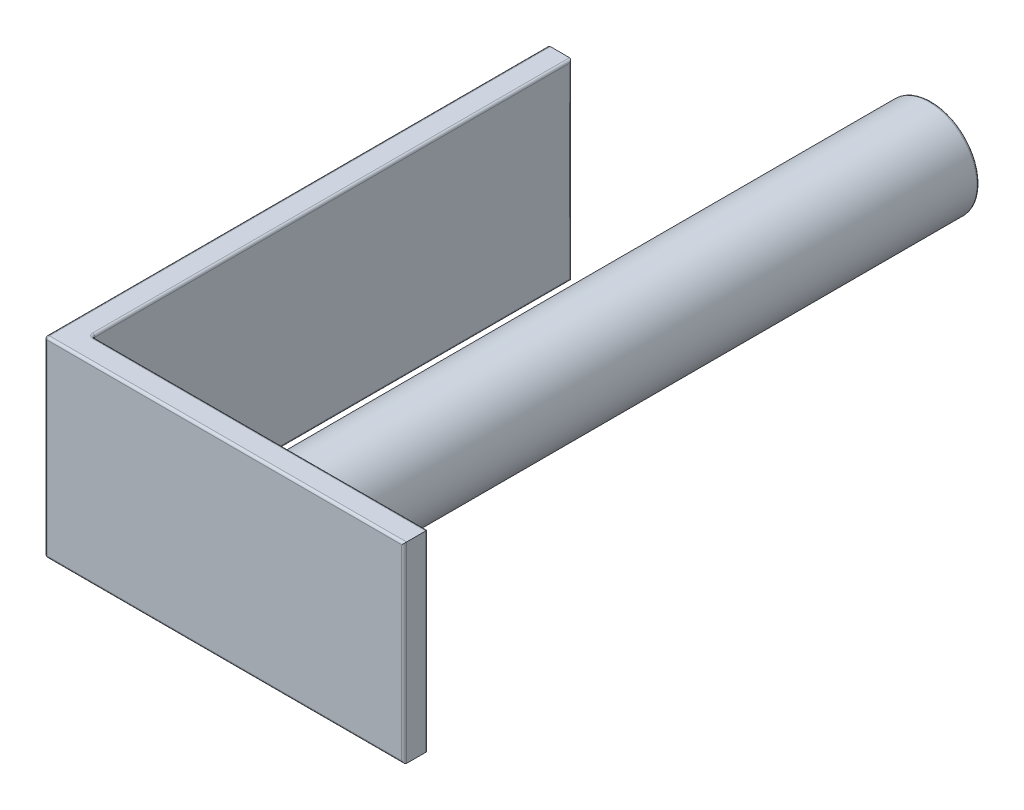
ISO-10303-21;
HEADER;
FILE_DESCRIPTION(('STEP AP214'),'2;1');
FILE_NAME('part.step','',(''),(''),'','','');
FILE_SCHEMA(('AUTOMOTIVE_DESIGN { 1 0 10303 214 1 1 1 1 }'));
ENDSEC;
DATA;
#1=APPLICATION_CONTEXT('core data for automotive mechanical design processes');
#2=APPLICATION_PROTOCOL_DEFINITION('international standard','automotive_design',2000,#1);
#3=PRODUCT_CONTEXT('',#1,'mechanical');
#4=PRODUCT('Part','Part','',(#3));
#5=PRODUCT_RELATED_PRODUCT_CATEGORY('part','',(#4));
#6=PRODUCT_DEFINITION_FORMATION('','',#4);
#7=PRODUCT_DEFINITION_CONTEXT('part definition',#1,'design');
#8=PRODUCT_DEFINITION('design','',#6,#7);
#9=PRODUCT_DEFINITION_SHAPE('','',#8);
#10=(LENGTH_UNIT() NAMED_UNIT(*) SI_UNIT(.MILLI.,.METRE.));
#11=(NAMED_UNIT(*) PLANE_ANGLE_UNIT() SI_UNIT($,.RADIAN.));
#12=(NAMED_UNIT(*) SI_UNIT($,.STERADIAN.) SOLID_ANGLE_UNIT());
#13=UNCERTAINTY_MEASURE_WITH_UNIT(LENGTH_MEASURE(1.E-05),#10,'distance_accuracy_value','');
#14=(GEOMETRIC_REPRESENTATION_CONTEXT(3) GLOBAL_UNCERTAINTY_ASSIGNED_CONTEXT((#13)) GLOBAL_UNIT_ASSIGNED_CONTEXT((#10,
#11,#12)) REPRESENTATION_CONTEXT('',''));
#15=CARTESIAN_POINT('',(0.,0.,0.));
#16=DIRECTION('',(0.,0.,1.));
#17=DIRECTION('',(1.,0.,0.));
#18=AXIS2_PLACEMENT_3D('',#15,#16,#17);
#19=CARTESIAN_POINT('',(0.,0.,-711.2));
#20=DIRECTION('',(0.,0.,1.));
#21=DIRECTION('',(1.,0.,0.));
#22=AXIS2_PLACEMENT_3D('',#19,#20,#21);
#23=CYLINDRICAL_SURFACE('',#22,50.8);
#24=CARTESIAN_POINT('',(0.,0.,-2.5400000000001));
#25=DIRECTION('',(0.,0.,1.));
#26=DIRECTION('',(1.,0.,0.));
#27=AXIS2_PLACEMENT_3D('',#24,#25,#26);
#28=CIRCLE('',#27,50.8);
#29=CARTESIAN_POINT('',(50.8,0.,-2.54000000000011));
#30=VERTEX_POINT('',#29);
#31=EDGE_CURVE('E244',#30,#30,#28,.F.);
#32=ORIENTED_EDGE('',*,*,#31,.T.);
#33=EDGE_LOOP('',(#32));
#34=FACE_BOUND('',#33,.T.);
#35=CARTESIAN_POINT('',(0.,0.,-708.66));
#36=DIRECTION('',(0.,0.,1.));
#37=DIRECTION('',(1.,0.,0.));
#38=AXIS2_PLACEMENT_3D('',#35,#36,#37);
#39=CIRCLE('',#38,50.8);
#40=CARTESIAN_POINT('',(50.8,0.,-708.66));
#41=VERTEX_POINT('',#40);
#42=EDGE_CURVE('E241',#41,#41,#39,.T.);
#43=ORIENTED_EDGE('',*,*,#42,.T.);
#44=EDGE_LOOP('',(#43));
#45=FACE_BOUND('',#44,.T.);
#46=ADVANCED_FACE('F39',(#34,#45),#23,.T.);
#47=CARTESIAN_POINT('',(0.,0.,-711.2));
#48=DIRECTION('',(0.,0.,1.));
#49=DIRECTION('',(1.,0.,0.));
#50=AXIS2_PLACEMENT_3D('',#47,#48,#49);
#51=PLANE('',#50);
#52=CARTESIAN_POINT('',(0.,0.,-711.2));
#53=DIRECTION('',(0.,0.,1.));
#54=DIRECTION('',(1.,0.,0.));
#55=AXIS2_PLACEMENT_3D('',#52,#53,#54);
#56=CIRCLE('',#55,48.26);
#57=CARTESIAN_POINT('',(48.26,0.,-711.2));
#58=VERTEX_POINT('',#57);
#59=EDGE_CURVE('E247',#58,#58,#56,.F.);
#60=ORIENTED_EDGE('',*,*,#59,.T.);
#61=EDGE_LOOP('',(#60));
#62=FACE_BOUND('',#61,.T.);
#63=ADVANCED_FACE('F347',(#62),#51,.F.);
#64=CARTESIAN_POINT('',(-177.8,101.6,0.));
#65=DIRECTION('',(-1.,0.,0.));
#66=DIRECTION('',(0.,0.,1.));
#67=AXIS2_PLACEMENT_3D('',#64,#65,#66);
#68=PLANE('',#67);
#69=DIRECTION('',(0.,-1.,0.));
#70=VECTOR('',#69,1.);
#71=CARTESIAN_POINT('',(-177.8,-101.6,-2.53999999999996));
#72=LINE('',#71,#70);
#73=CARTESIAN_POINT('',(-177.8,99.06,-2.53999999999996));
#74=VERTEX_POINT('',#73);
#75=CARTESIAN_POINT('',(-177.8,-99.06,-2.53999999999996));
#76=VERTEX_POINT('',#75);
#77=EDGE_CURVE('E166',#74,#76,#72,.T.);
#78=ORIENTED_EDGE('',*,*,#77,.T.);
#79=DIRECTION('',(0.,0.,-1.));
#80=VECTOR('',#79,1.);
#81=CARTESIAN_POINT('',(-177.8,-99.06,-508.));
#82=LINE('',#81,#80);
#83=CARTESIAN_POINT('',(-177.8,-99.06,-505.46));
#84=VERTEX_POINT('',#83);
#85=EDGE_CURVE('E64',#76,#84,#82,.T.);
#86=ORIENTED_EDGE('',*,*,#85,.T.);
#87=DIRECTION('',(0.,-1.,0.));
#88=VECTOR('',#87,1.);
#89=CARTESIAN_POINT('',(-177.8,101.6,-505.46));
#90=LINE('',#89,#88);
#91=CARTESIAN_POINT('',(-177.8,99.06,-505.46));
#92=VERTEX_POINT('',#91);
#93=EDGE_CURVE('E252',#84,#92,#90,.F.);
#94=ORIENTED_EDGE('',*,*,#93,.T.);
#95=DIRECTION('',(0.,0.,-1.));
#96=VECTOR('',#95,1.);
#97=CARTESIAN_POINT('',(-177.8,99.06,0.));
#98=LINE('',#97,#96);
#99=EDGE_CURVE('E250',#92,#74,#98,.F.);
#100=ORIENTED_EDGE('',*,*,#99,.T.);
#101=EDGE_LOOP('',(#78,#86,#94,#100));
#102=FACE_BOUND('',#101,.T.);
#103=ADVANCED_FACE('F353',(#102),#68,.F.);
#104=CARTESIAN_POINT('',(-203.2,101.6,-508.));
#105=DIRECTION('',(0.,0.,-1.));
#106=DIRECTION('',(-1.,0.,0.));
#107=AXIS2_PLACEMENT_3D('',#104,#105,#106);
#108=PLANE('',#107);
#109=DIRECTION('',(1.,0.,0.));
#110=VECTOR('',#109,1.);
#111=CARTESIAN_POINT('',(-203.2,-101.6,-508.));
#112=LINE('',#111,#110);
#113=CARTESIAN_POINT('',(-200.66,-101.6,-508.));
#114=VERTEX_POINT('',#113);
#115=CARTESIAN_POINT('',(-180.34,-101.6,-508.));
#116=VERTEX_POINT('',#115);
#117=EDGE_CURVE('E271',#114,#116,#112,.T.);
#118=ORIENTED_EDGE('',*,*,#117,.F.);
#119=DIRECTION('',(0.,-1.,0.));
#120=VECTOR('',#119,1.);
#121=CARTESIAN_POINT('',(-200.66,101.6,-508.));
#122=LINE('',#121,#120);
#123=CARTESIAN_POINT('',(-200.66,101.6,-508.));
#124=VERTEX_POINT('',#123);
#125=EDGE_CURVE('E11',#114,#124,#122,.F.);
#126=ORIENTED_EDGE('',*,*,#125,.T.);
#127=DIRECTION('',(1.,0.,0.));
#128=VECTOR('',#127,1.);
#129=CARTESIAN_POINT('',(-203.2,101.6,-508.));
#130=LINE('',#129,#128);
#131=CARTESIAN_POINT('',(-180.34,101.6,-508.));
#132=VERTEX_POINT('',#131);
#133=EDGE_CURVE('E188',#124,#132,#130,.T.);
#134=ORIENTED_EDGE('',*,*,#133,.T.);
#135=DIRECTION('',(0.,-1.,0.));
#136=VECTOR('',#135,1.);
#137=CARTESIAN_POINT('',(-180.34,-101.6,-508.));
#138=LINE('',#137,#136);
#139=EDGE_CURVE('E48',#132,#116,#138,.T.);
#140=ORIENTED_EDGE('',*,*,#139,.T.);
#141=EDGE_LOOP('',(#118,#126,#134,#140));
#142=FACE_BOUND('',#141,.T.);
#143=ADVANCED_FACE('F597',(#142),#108,.T.);
#144=CARTESIAN_POINT('',(-203.2,101.6,0.));
#145=DIRECTION('',(-1.,0.,0.));
#146=DIRECTION('',(0.,0.,1.));
#147=AXIS2_PLACEMENT_3D('',#144,#145,#146);
#148=PLANE('',#147);
#149=DIRECTION('',(0.,-1.,0.));
#150=VECTOR('',#149,1.);
#151=CARTESIAN_POINT('',(-203.2,101.6,22.86));
#152=LINE('',#151,#150);
#153=CARTESIAN_POINT('',(-203.2,-99.06,22.86));
#154=VERTEX_POINT('',#153);
#155=CARTESIAN_POINT('',(-203.2,99.06,22.86));
#156=VERTEX_POINT('',#155);
#157=EDGE_CURVE('E222',#154,#156,#152,.F.);
#158=ORIENTED_EDGE('',*,*,#157,.T.);
#159=DIRECTION('',(0.,0.,-1.));
#160=VECTOR('',#159,1.);
#161=CARTESIAN_POINT('',(-203.2,99.06,-508.));
#162=LINE('',#161,#160);
#163=CARTESIAN_POINT('',(-203.2,99.06,-505.46));
#164=VERTEX_POINT('',#163);
#165=EDGE_CURVE('E225',#156,#164,#162,.T.);
#166=ORIENTED_EDGE('',*,*,#165,.T.);
#167=DIRECTION('',(0.,-1.,0.));
#168=VECTOR('',#167,1.);
#169=CARTESIAN_POINT('',(-203.2,101.6,-505.46));
#170=LINE('',#169,#168);
#171=CARTESIAN_POINT('',(-203.2,-99.06,-505.46));
#172=VERTEX_POINT('',#171);
#173=EDGE_CURVE('E220',#164,#172,#170,.T.);
#174=ORIENTED_EDGE('',*,*,#173,.T.);
#175=DIRECTION('',(0.,0.,-1.));
#176=VECTOR('',#175,1.);
#177=CARTESIAN_POINT('',(-203.2,-99.06,0.));
#178=LINE('',#177,#176);
#179=EDGE_CURVE('E218',#172,#154,#178,.F.);
#180=ORIENTED_EDGE('',*,*,#179,.T.);
#181=EDGE_LOOP('',(#158,#166,#174,#180));
#182=FACE_BOUND('',#181,.T.);
#183=ADVANCED_FACE('F313',(#182),#148,.T.);
#184=CARTESIAN_POINT('',(177.8,101.6,25.3999999999999));
#185=DIRECTION('',(0.,0.,1.));
#186=DIRECTION('',(1.,0.,0.));
#187=AXIS2_PLACEMENT_3D('',#184,#185,#186);
#188=PLANE('',#187);
#189=DIRECTION('',(-1.,0.,0.));
#190=VECTOR('',#189,1.);
#191=CARTESIAN_POINT('',(-203.2,99.06,25.4000000000001));
#192=LINE('',#191,#190);
#193=CARTESIAN_POINT('',(175.26,99.06,25.3999999999999));
#194=VERTEX_POINT('',#193);
#195=CARTESIAN_POINT('',(-200.66,99.06,25.4));
#196=VERTEX_POINT('',#195);
#197=EDGE_CURVE('E213',#194,#196,#192,.T.);
#198=ORIENTED_EDGE('',*,*,#197,.T.);
#199=DIRECTION('',(0.,-1.,0.));
#200=VECTOR('',#199,1.);
#201=CARTESIAN_POINT('',(-200.66,101.6,25.4));
#202=LINE('',#201,#200);
#203=CARTESIAN_POINT('',(-200.66,-99.06,25.4));
#204=VERTEX_POINT('',#203);
#205=EDGE_CURVE('E215',#196,#204,#202,.T.);
#206=ORIENTED_EDGE('',*,*,#205,.T.);
#207=DIRECTION('',(-1.,0.,0.));
#208=VECTOR('',#207,1.);
#209=CARTESIAN_POINT('',(177.8,-99.06,25.3999999999999));
#210=LINE('',#209,#208);
#211=CARTESIAN_POINT('',(175.26,-99.06,25.3999999999999));
#212=VERTEX_POINT('',#211);
#213=EDGE_CURVE('E209',#204,#212,#210,.F.);
#214=ORIENTED_EDGE('',*,*,#213,.T.);
#215=DIRECTION('',(0.,-1.,0.));
#216=VECTOR('',#215,1.);
#217=CARTESIAN_POINT('',(175.26,101.6,25.3999999999999));
#218=LINE('',#217,#216);
#219=EDGE_CURVE('E211',#212,#194,#218,.F.);
#220=ORIENTED_EDGE('',*,*,#219,.T.);
#221=EDGE_LOOP('',(#198,#206,#214,#220));
#222=FACE_BOUND('',#221,.T.);
#223=ADVANCED_FACE('F331',(#222),#188,.T.);
#224=CARTESIAN_POINT('',(177.8,101.6,0.));
#225=DIRECTION('',(1.,0.,0.));
#226=DIRECTION('',(0.,0.,-1.));
#227=AXIS2_PLACEMENT_3D('',#224,#225,#226);
#228=PLANE('',#227);
#229=DIRECTION('',(0.,0.,1.));
#230=VECTOR('',#229,1.);
#231=CARTESIAN_POINT('',(177.8,101.6,0.));
#232=LINE('',#231,#230);
#233=CARTESIAN_POINT('',(177.8,101.6,2.53999999999993));
#234=VERTEX_POINT('',#233);
#235=CARTESIAN_POINT('',(177.8,101.6,22.8599999999999));
#236=VERTEX_POINT('',#235);
#237=EDGE_CURVE('E184',#234,#236,#232,.T.);
#238=ORIENTED_EDGE('',*,*,#237,.T.);
#239=DIRECTION('',(0.,-1.,0.));
#240=VECTOR('',#239,1.);
#241=CARTESIAN_POINT('',(177.8,101.6,22.8599999999999));
#242=LINE('',#241,#240);
#243=CARTESIAN_POINT('',(177.8,-101.6,22.8599999999999));
#244=VERTEX_POINT('',#243);
#245=EDGE_CURVE('E239',#236,#244,#242,.T.);
#246=ORIENTED_EDGE('',*,*,#245,.T.);
#247=DIRECTION('',(0.,0.,1.));
#248=VECTOR('',#247,1.);
#249=CARTESIAN_POINT('',(177.8,-101.6,0.));
#250=LINE('',#249,#248);
#251=CARTESIAN_POINT('',(177.8,-101.6,2.53999999999993));
#252=VERTEX_POINT('',#251);
#253=EDGE_CURVE('E191',#252,#244,#250,.T.);
#254=ORIENTED_EDGE('',*,*,#253,.F.);
#255=DIRECTION('',(0.,-1.,0.));
#256=VECTOR('',#255,1.);
#257=CARTESIAN_POINT('',(177.8,101.6,2.53999999999993));
#258=LINE('',#257,#256);
#259=EDGE_CURVE('E237',#252,#234,#258,.F.);
#260=ORIENTED_EDGE('',*,*,#259,.T.);
#261=EDGE_LOOP('',(#238,#246,#254,#260));
#262=FACE_BOUND('',#261,.T.);
#263=ADVANCED_FACE('F570',(#262),#228,.T.);
#264=CARTESIAN_POINT('',(177.8,101.6,0.));
#265=DIRECTION('',(0.,0.,1.));
#266=DIRECTION('',(1.,0.,0.));
#267=AXIS2_PLACEMENT_3D('',#264,#265,#266);
#268=PLANE('',#267);
#269=CARTESIAN_POINT('',(0.,0.,0.));
#270=DIRECTION('',(0.,0.,1.));
#271=DIRECTION('',(1.,0.,0.));
#272=AXIS2_PLACEMENT_3D('',#269,#270,#271);
#273=CIRCLE('',#272,53.34);
#274=CARTESIAN_POINT('',(53.34,0.,0.));
#275=VERTEX_POINT('',#274);
#276=EDGE_CURVE('E195',#275,#275,#273,.T.);
#277=ORIENTED_EDGE('',*,*,#276,.T.);
#278=EDGE_LOOP('',(#277));
#279=FACE_BOUND('',#278,.T.);
#280=DIRECTION('',(0.,-1.,0.));
#281=VECTOR('',#280,1.);
#282=CARTESIAN_POINT('',(175.26,-101.6,0.));
#283=LINE('',#282,#281);
#284=CARTESIAN_POINT('',(175.26,99.06,0.));
#285=VERTEX_POINT('',#284);
#286=CARTESIAN_POINT('',(175.26,-99.06,0.));
#287=VERTEX_POINT('',#286);
#288=EDGE_CURVE('E159',#285,#287,#283,.T.);
#289=ORIENTED_EDGE('',*,*,#288,.T.);
#290=DIRECTION('',(-1.,0.,0.));
#291=VECTOR('',#290,1.);
#292=CARTESIAN_POINT('',(-177.8,-99.06,0.));
#293=LINE('',#292,#291);
#294=CARTESIAN_POINT('',(-175.26,-99.06,0.));
#295=VERTEX_POINT('',#294);
#296=EDGE_CURVE('E157',#287,#295,#293,.T.);
#297=ORIENTED_EDGE('',*,*,#296,.T.);
#298=DIRECTION('',(0.,-1.,0.));
#299=VECTOR('',#298,1.);
#300=CARTESIAN_POINT('',(-175.26,101.6,0.));
#301=LINE('',#300,#299);
#302=CARTESIAN_POINT('',(-175.26,99.06,0.));
#303=VERTEX_POINT('',#302);
#304=EDGE_CURVE('E150',#295,#303,#301,.F.);
#305=ORIENTED_EDGE('',*,*,#304,.T.);
#306=DIRECTION('',(-1.,0.,0.));
#307=VECTOR('',#306,1.);
#308=CARTESIAN_POINT('',(177.8,99.06,0.));
#309=LINE('',#308,#307);
#310=EDGE_CURVE('E154',#303,#285,#309,.F.);
#311=ORIENTED_EDGE('',*,*,#310,.T.);
#312=EDGE_LOOP('',(#289,#297,#305,#311));
#313=FACE_BOUND('',#312,.T.);
#314=ADVANCED_FACE('F152',(#279,#313),#268,.F.);
#315=CARTESIAN_POINT('',(0.,101.6,0.));
#316=DIRECTION('',(0.,-1.,0.));
#317=DIRECTION('',(-1.,0.,0.));
#318=AXIS2_PLACEMENT_3D('',#315,#316,#317);
#319=PLANE('',#318);
#320=DIRECTION('',(0.,0.,-1.));
#321=VECTOR('',#320,1.);
#322=CARTESIAN_POINT('',(-200.66,101.6,25.4000000000001));
#323=LINE('',#322,#321);
#324=CARTESIAN_POINT('',(-200.66,101.6,22.86));
#325=VERTEX_POINT('',#324);
#326=EDGE_CURVE('E232',#124,#325,#323,.F.);
#327=ORIENTED_EDGE('',*,*,#326,.T.);
#328=DIRECTION('',(-1.,0.,0.));
#329=VECTOR('',#328,1.);
#330=CARTESIAN_POINT('',(177.8,101.6,22.8599999999999));
#331=LINE('',#330,#329);
#332=EDGE_CURVE('E234',#325,#236,#331,.F.);
#333=ORIENTED_EDGE('',*,*,#332,.T.);
#334=ORIENTED_EDGE('',*,*,#237,.F.);
#335=DIRECTION('',(-1.,0.,0.));
#336=VECTOR('',#335,1.);
#337=CARTESIAN_POINT('',(0.,101.6,2.53999999999999));
#338=LINE('',#337,#336);
#339=CARTESIAN_POINT('',(-175.26,101.6,2.54000000000004));
#340=VERTEX_POINT('',#339);
#341=EDGE_CURVE('E228',#234,#340,#338,.T.);
#342=ORIENTED_EDGE('',*,*,#341,.T.);
#343=CARTESIAN_POINT('',(-175.26,101.6,-2.53999999999996));
#344=DIRECTION('',(0.,-1.,0.));
#345=DIRECTION('',(0.,0.,-1.));
#346=AXIS2_PLACEMENT_3D('',#343,#344,#345);
#347=CIRCLE('',#346,5.08);
#348=CARTESIAN_POINT('',(-180.34,101.6,-2.53999999999996));
#349=VERTEX_POINT('',#348);
#350=EDGE_CURVE('E175',#349,#340,#347,.F.);
#351=ORIENTED_EDGE('',*,*,#350,.F.);
#352=DIRECTION('',(0.,0.,-1.));
#353=VECTOR('',#352,1.);
#354=CARTESIAN_POINT('',(-180.34,101.6,0.));
#355=LINE('',#354,#353);
#356=EDGE_CURVE('E230',#349,#132,#355,.T.);
#357=ORIENTED_EDGE('',*,*,#356,.T.);
#358=ORIENTED_EDGE('',*,*,#133,.F.);
#359=EDGE_LOOP('',(#327,#333,#334,#342,#351,#357,#358));
#360=FACE_BOUND('',#359,.T.);
#361=ADVANCED_FACE('F551',(#360),#319,.F.);
#362=CARTESIAN_POINT('',(0.,-101.6,0.));
#363=DIRECTION('',(0.,-1.,0.));
#364=DIRECTION('',(-1.,0.,0.));
#365=AXIS2_PLACEMENT_3D('',#362,#363,#364);
#366=PLANE('',#365);
#367=CARTESIAN_POINT('',(-175.26,-101.6,-2.53999999999996));
#368=DIRECTION('',(0.,-1.,0.));
#369=DIRECTION('',(0.,0.,-1.));
#370=AXIS2_PLACEMENT_3D('',#367,#368,#369);
#371=CIRCLE('',#370,5.08);
#372=CARTESIAN_POINT('',(-175.26,-101.6,2.54000000000004));
#373=VERTEX_POINT('',#372);
#374=CARTESIAN_POINT('',(-180.34,-101.6,-2.53999999999996));
#375=VERTEX_POINT('',#374);
#376=EDGE_CURVE('E202',#373,#375,#371,.T.);
#377=ORIENTED_EDGE('',*,*,#376,.F.);
#378=DIRECTION('',(-1.,0.,0.));
#379=VECTOR('',#378,1.);
#380=CARTESIAN_POINT('',(177.8,-101.6,2.53999999999993));
#381=LINE('',#380,#379);
#382=EDGE_CURVE('E206',#373,#252,#381,.F.);
#383=ORIENTED_EDGE('',*,*,#382,.T.);
#384=ORIENTED_EDGE('',*,*,#253,.T.);
#385=DIRECTION('',(-1.,0.,0.));
#386=VECTOR('',#385,1.);
#387=CARTESIAN_POINT('',(0.,-101.6,22.86));
#388=LINE('',#387,#386);
#389=CARTESIAN_POINT('',(-200.66,-101.6,22.86));
#390=VERTEX_POINT('',#389);
#391=EDGE_CURVE('E200',#244,#390,#388,.T.);
#392=ORIENTED_EDGE('',*,*,#391,.T.);
#393=DIRECTION('',(0.,0.,-1.));
#394=VECTOR('',#393,1.);
#395=CARTESIAN_POINT('',(-200.66,-101.6,0.));
#396=LINE('',#395,#394);
#397=EDGE_CURVE('E198',#390,#114,#396,.T.);
#398=ORIENTED_EDGE('',*,*,#397,.T.);
#399=ORIENTED_EDGE('',*,*,#117,.T.);
#400=DIRECTION('',(0.,0.,-1.));
#401=VECTOR('',#400,1.);
#402=CARTESIAN_POINT('',(-180.34,-101.6,0.));
#403=LINE('',#402,#401);
#404=EDGE_CURVE('E204',#116,#375,#403,.F.);
#405=ORIENTED_EDGE('',*,*,#404,.T.);
#406=EDGE_LOOP('',(#377,#383,#384,#392,#398,#399,#405));
#407=FACE_BOUND('',#406,.T.);
#408=ADVANCED_FACE('F388',(#407),#366,.T.);
#409=CARTESIAN_POINT('',(-180.34,99.06,0.));
#410=DIRECTION('',(0.,0.,-1.));
#411=DIRECTION('',(-1.,0.,0.));
#412=AXIS2_PLACEMENT_3D('',#409,#410,#411);
#413=CYLINDRICAL_SURFACE('',#412,2.54);
#414=CARTESIAN_POINT('',(-180.34,99.06,-505.46));
#415=DIRECTION('',(0.,-0.707106781186547,-0.707106781186547));
#416=DIRECTION('',(0.,0.707106781186547,-0.707106781186547));
#417=AXIS2_PLACEMENT_3D('',#414,#415,#416);
#418=ELLIPSE('',#417,3.59210244842766,2.54);
#419=EDGE_CURVE('E178',#132,#92,#418,.T.);
#420=ORIENTED_EDGE('',*,*,#419,.F.);
#421=ORIENTED_EDGE('',*,*,#356,.F.);
#422=CARTESIAN_POINT('',(-180.34,99.06,-2.53999999999996));
#423=DIRECTION('',(0.,0.,1.));
#424=DIRECTION('',(1.,0.,0.));
#425=AXIS2_PLACEMENT_3D('',#422,#423,#424);
#426=CIRCLE('',#425,2.54);
#427=EDGE_CURVE('E269',#74,#349,#426,.T.);
#428=ORIENTED_EDGE('',*,*,#427,.F.);
#429=ORIENTED_EDGE('',*,*,#99,.F.);
#430=EDGE_LOOP('',(#420,#421,#428,#429));
#431=FACE_BOUND('',#430,.T.);
#432=ADVANCED_FACE('F385',(#431),#413,.T.);
#433=CARTESIAN_POINT('',(-175.26,99.06,-2.53999999999996));
#434=DIRECTION('',(0.,-1.,0.));
#435=DIRECTION('',(0.,0.,-1.));
#436=AXIS2_PLACEMENT_3D('',#433,#434,#435);
#437=TOROIDAL_SURFACE('',#436,5.08,2.54);
#438=ORIENTED_EDGE('',*,*,#427,.T.);
#439=ORIENTED_EDGE('',*,*,#350,.T.);
#440=CARTESIAN_POINT('',(-175.26,99.06,2.54000000000004));
#441=DIRECTION('',(-1.,0.,0.));
#442=DIRECTION('',(0.,0.,1.));
#443=AXIS2_PLACEMENT_3D('',#440,#441,#442);
#444=CIRCLE('',#443,2.54);
#445=EDGE_CURVE('E169',#303,#340,#444,.F.);
#446=ORIENTED_EDGE('',*,*,#445,.F.);
#447=CARTESIAN_POINT('',(-175.26,99.06,-2.53999999999996));
#448=DIRECTION('',(0.,-1.,0.));
#449=DIRECTION('',(0.,0.,-1.));
#450=AXIS2_PLACEMENT_3D('',#447,#448,#449);
#451=CIRCLE('',#450,2.54);
#452=EDGE_CURVE('E163',#74,#303,#451,.F.);
#453=ORIENTED_EDGE('',*,*,#452,.F.);
#454=EDGE_LOOP('',(#438,#439,#446,#453));
#455=FACE_BOUND('',#454,.T.);
#456=ADVANCED_FACE('F174',(#455),#437,.T.);
#457=CARTESIAN_POINT('',(-180.34,101.6,-505.46));
#458=DIRECTION('',(0.,1.,0.));
#459=DIRECTION('',(0.,0.,1.));
#460=AXIS2_PLACEMENT_3D('',#457,#458,#459);
#461=CYLINDRICAL_SURFACE('',#460,2.54);
#462=ORIENTED_EDGE('',*,*,#419,.T.);
#463=ORIENTED_EDGE('',*,*,#93,.F.);
#464=CARTESIAN_POINT('',(-180.34,-99.06,-505.46));
#465=DIRECTION('',(0.,-0.707106781186547,0.707106781186547));
#466=DIRECTION('',(0.,0.707106781186547,0.707106781186547));
#467=AXIS2_PLACEMENT_3D('',#464,#465,#466);
#468=ELLIPSE('',#467,3.59210244842766,2.54);
#469=EDGE_CURVE('E170',#116,#84,#468,.T.);
#470=ORIENTED_EDGE('',*,*,#469,.F.);
#471=ORIENTED_EDGE('',*,*,#139,.F.);
#472=EDGE_LOOP('',(#462,#463,#470,#471));
#473=FACE_BOUND('',#472,.T.);
#474=ADVANCED_FACE('F379',(#473),#461,.T.);
#475=CARTESIAN_POINT('',(0.,99.06,2.53999999999999));
#476=DIRECTION('',(-1.,0.,0.));
#477=DIRECTION('',(0.,0.,1.));
#478=AXIS2_PLACEMENT_3D('',#475,#476,#477);
#479=CYLINDRICAL_SURFACE('',#478,2.54);
#480=ORIENTED_EDGE('',*,*,#445,.T.);
#481=ORIENTED_EDGE('',*,*,#341,.F.);
#482=CARTESIAN_POINT('',(175.26,99.06,2.53999999999993));
#483=DIRECTION('',(-0.707106781186547,0.707106781186547,0.));
#484=DIRECTION('',(-0.707106781186547,-0.707106781186547,0.));
#485=AXIS2_PLACEMENT_3D('',#482,#483,#484);
#486=ELLIPSE('',#485,3.59210244842766,2.54);
#487=EDGE_CURVE('E182',#285,#234,#486,.F.);
#488=ORIENTED_EDGE('',*,*,#487,.F.);
#489=ORIENTED_EDGE('',*,*,#310,.F.);
#490=EDGE_LOOP('',(#480,#481,#488,#489));
#491=FACE_BOUND('',#490,.T.);
#492=ADVANCED_FACE('F180',(#491),#479,.T.);
#493=CARTESIAN_POINT('',(-175.26,101.6,-2.53999999999996));
#494=DIRECTION('',(0.,1.,0.));
#495=DIRECTION('',(0.,0.,1.));
#496=AXIS2_PLACEMENT_3D('',#493,#494,#495);
#497=CYLINDRICAL_SURFACE('',#496,2.54);
#498=ORIENTED_EDGE('',*,*,#452,.T.);
#499=ORIENTED_EDGE('',*,*,#304,.F.);
#500=CARTESIAN_POINT('',(-175.26,-99.06,-2.53999999999996));
#501=DIRECTION('',(0.,-1.,0.));
#502=DIRECTION('',(0.,0.,-1.));
#503=AXIS2_PLACEMENT_3D('',#500,#501,#502);
#504=CIRCLE('',#503,2.54);
#505=EDGE_CURVE('E262',#76,#295,#504,.F.);
#506=ORIENTED_EDGE('',*,*,#505,.F.);
#507=ORIENTED_EDGE('',*,*,#77,.F.);
#508=EDGE_LOOP('',(#498,#499,#506,#507));
#509=FACE_BOUND('',#508,.T.);
#510=ADVANCED_FACE('F165',(#509),#497,.F.);
#511=CARTESIAN_POINT('',(-180.34,-99.06,0.));
#512=DIRECTION('',(0.,0.,1.));
#513=DIRECTION('',(1.,0.,0.));
#514=AXIS2_PLACEMENT_3D('',#511,#512,#513);
#515=CYLINDRICAL_SURFACE('',#514,2.54);
#516=ORIENTED_EDGE('',*,*,#469,.T.);
#517=ORIENTED_EDGE('',*,*,#85,.F.);
#518=CARTESIAN_POINT('',(-180.34,-99.06,-2.53999999999996));
#519=DIRECTION('',(0.,0.,1.));
#520=DIRECTION('',(1.,0.,0.));
#521=AXIS2_PLACEMENT_3D('',#518,#519,#520);
#522=CIRCLE('',#521,2.54);
#523=EDGE_CURVE('E56',#375,#76,#522,.T.);
#524=ORIENTED_EDGE('',*,*,#523,.F.);
#525=ORIENTED_EDGE('',*,*,#404,.F.);
#526=EDGE_LOOP('',(#516,#517,#524,#525));
#527=FACE_BOUND('',#526,.T.);
#528=ADVANCED_FACE('F370',(#527),#515,.T.);
#529=CARTESIAN_POINT('',(175.26,101.6,2.53999999999993));
#530=DIRECTION('',(0.,1.,0.));
#531=DIRECTION('',(0.,0.,1.));
#532=AXIS2_PLACEMENT_3D('',#529,#530,#531);
#533=CYLINDRICAL_SURFACE('',#532,2.54);
#534=ORIENTED_EDGE('',*,*,#487,.T.);
#535=ORIENTED_EDGE('',*,*,#259,.F.);
#536=CARTESIAN_POINT('',(175.26,-99.06,2.53999999999993));
#537=DIRECTION('',(0.707106781186547,0.707106781186547,0.));
#538=DIRECTION('',(-0.707106781186547,0.707106781186547,0.));
#539=AXIS2_PLACEMENT_3D('',#536,#537,#538);
#540=ELLIPSE('',#539,3.59210244842766,2.54);
#541=EDGE_CURVE('E259',#287,#252,#540,.F.);
#542=ORIENTED_EDGE('',*,*,#541,.F.);
#543=ORIENTED_EDGE('',*,*,#288,.F.);
#544=EDGE_LOOP('',(#534,#535,#542,#543));
#545=FACE_BOUND('',#544,.T.);
#546=ADVANCED_FACE('F367',(#545),#533,.T.);
#547=CARTESIAN_POINT('',(-175.26,-99.06,-2.53999999999996));
#548=DIRECTION('',(0.,-1.,0.));
#549=DIRECTION('',(0.,0.,-1.));
#550=AXIS2_PLACEMENT_3D('',#547,#548,#549);
#551=TOROIDAL_SURFACE('',#550,5.08,2.54);
#552=ORIENTED_EDGE('',*,*,#523,.T.);
#553=ORIENTED_EDGE('',*,*,#505,.T.);
#554=CARTESIAN_POINT('',(-175.26,-99.06,2.54000000000004));
#555=DIRECTION('',(-1.,0.,0.));
#556=DIRECTION('',(0.,0.,1.));
#557=AXIS2_PLACEMENT_3D('',#554,#555,#556);
#558=CIRCLE('',#557,2.54);
#559=EDGE_CURVE('E257',#373,#295,#558,.F.);
#560=ORIENTED_EDGE('',*,*,#559,.F.);
#561=ORIENTED_EDGE('',*,*,#376,.T.);
#562=EDGE_LOOP('',(#552,#553,#560,#561));
#563=FACE_BOUND('',#562,.T.);
#564=ADVANCED_FACE('F363',(#563),#551,.T.);
#565=CARTESIAN_POINT('',(177.8,-99.06,2.53999999999993));
#566=DIRECTION('',(1.,0.,0.));
#567=DIRECTION('',(0.,0.,-1.));
#568=AXIS2_PLACEMENT_3D('',#565,#566,#567);
#569=CYLINDRICAL_SURFACE('',#568,2.54);
#570=ORIENTED_EDGE('',*,*,#541,.T.);
#571=ORIENTED_EDGE('',*,*,#382,.F.);
#572=ORIENTED_EDGE('',*,*,#559,.T.);
#573=ORIENTED_EDGE('',*,*,#296,.F.);
#574=EDGE_LOOP('',(#570,#571,#572,#573));
#575=FACE_BOUND('',#574,.T.);
#576=ADVANCED_FACE('F359',(#575),#569,.T.);
#577=CARTESIAN_POINT('',(175.26,101.6,22.8599999999999));
#578=DIRECTION('',(0.,-1.,0.));
#579=DIRECTION('',(0.,0.,-1.));
#580=AXIS2_PLACEMENT_3D('',#577,#578,#579);
#581=CYLINDRICAL_SURFACE('',#580,2.54);
#582=CARTESIAN_POINT('',(175.26,-99.06,22.8599999999999));
#583=DIRECTION('',(-0.707106781186547,-0.707106781186547,0.));
#584=DIRECTION('',(-0.707106781186547,0.707106781186547,0.));
#585=AXIS2_PLACEMENT_3D('',#582,#583,#584);
#586=ELLIPSE('',#585,3.59210244842766,2.54);
#587=EDGE_CURVE('E291',#244,#212,#586,.T.);
#588=ORIENTED_EDGE('',*,*,#587,.F.);
#589=ORIENTED_EDGE('',*,*,#245,.F.);
#590=CARTESIAN_POINT('',(175.26,99.06,22.8599999999999));
#591=DIRECTION('',(0.707106781186547,-0.707106781186547,0.));
#592=DIRECTION('',(-0.707106781186547,-0.707106781186547,0.));
#593=AXIS2_PLACEMENT_3D('',#590,#591,#592);
#594=ELLIPSE('',#593,3.59210244842766,2.54);
#595=EDGE_CURVE('E293',#194,#236,#594,.F.);
#596=ORIENTED_EDGE('',*,*,#595,.F.);
#597=ORIENTED_EDGE('',*,*,#219,.F.);
#598=EDGE_LOOP('',(#588,#589,#596,#597));
#599=FACE_BOUND('',#598,.T.);
#600=ADVANCED_FACE('F362',(#599),#581,.T.);
#601=CARTESIAN_POINT('',(-200.66,101.6,-505.46));
#602=DIRECTION('',(0.,-1.,0.));
#603=DIRECTION('',(0.,0.,-1.));
#604=AXIS2_PLACEMENT_3D('',#601,#602,#603);
#605=CYLINDRICAL_SURFACE('',#604,2.54);
#606=CARTESIAN_POINT('',(-200.66,-99.06,-505.46));
#607=DIRECTION('',(0.,0.707106781186547,-0.707106781186547));
#608=DIRECTION('',(0.,-0.707106781186547,-0.707106781186547));
#609=AXIS2_PLACEMENT_3D('',#606,#607,#608);
#610=ELLIPSE('',#609,3.59210244842766,2.54);
#611=EDGE_CURVE('E288',#172,#114,#610,.F.);
#612=ORIENTED_EDGE('',*,*,#611,.F.);
#613=ORIENTED_EDGE('',*,*,#173,.F.);
#614=CARTESIAN_POINT('',(-200.66,99.06,-505.46));
#615=DIRECTION('',(0.,0.707106781186547,0.707106781186547));
#616=DIRECTION('',(0.,-0.707106781186547,0.707106781186547));
#617=AXIS2_PLACEMENT_3D('',#614,#615,#616);
#618=ELLIPSE('',#617,3.59210244842766,2.54);
#619=EDGE_CURVE('E43',#124,#164,#618,.T.);
#620=ORIENTED_EDGE('',*,*,#619,.F.);
#621=ORIENTED_EDGE('',*,*,#125,.F.);
#622=EDGE_LOOP('',(#612,#613,#620,#621));
#623=FACE_BOUND('',#622,.T.);
#624=ADVANCED_FACE('F310',(#623),#605,.T.);
#625=CARTESIAN_POINT('',(-200.66,99.06,0.));
#626=DIRECTION('',(0.,0.,1.));
#627=DIRECTION('',(1.,0.,0.));
#628=AXIS2_PLACEMENT_3D('',#625,#626,#627);
#629=CYLINDRICAL_SURFACE('',#628,2.54);
#630=ORIENTED_EDGE('',*,*,#619,.T.);
#631=ORIENTED_EDGE('',*,*,#165,.F.);
#632=CARTESIAN_POINT('',(-200.66,99.06,22.86));
#633=DIRECTION('',(0.,0.,1.));
#634=DIRECTION('',(1.,0.,0.));
#635=AXIS2_PLACEMENT_3D('',#632,#633,#634);
#636=CIRCLE('',#635,2.54);
#637=EDGE_CURVE('E285',#325,#156,#636,.T.);
#638=ORIENTED_EDGE('',*,*,#637,.F.);
#639=ORIENTED_EDGE('',*,*,#326,.F.);
#640=EDGE_LOOP('',(#630,#631,#638,#639));
#641=FACE_BOUND('',#640,.T.);
#642=ADVANCED_FACE('F304',(#641),#629,.T.);
#643=CARTESIAN_POINT('',(177.8,99.06,22.8599999999999));
#644=DIRECTION('',(1.,0.,0.));
#645=DIRECTION('',(0.,0.,-1.));
#646=AXIS2_PLACEMENT_3D('',#643,#644,#645);
#647=CYLINDRICAL_SURFACE('',#646,2.54);
#648=ORIENTED_EDGE('',*,*,#595,.T.);
#649=ORIENTED_EDGE('',*,*,#332,.F.);
#650=CARTESIAN_POINT('',(-200.66,99.06,22.86));
#651=DIRECTION('',(-1.,0.,0.));
#652=DIRECTION('',(0.,-1.,0.));
#653=AXIS2_PLACEMENT_3D('',#650,#651,#652);
#654=CIRCLE('',#653,2.54);
#655=EDGE_CURVE('E282',#196,#325,#654,.T.);
#656=ORIENTED_EDGE('',*,*,#655,.F.);
#657=ORIENTED_EDGE('',*,*,#197,.F.);
#658=EDGE_LOOP('',(#648,#649,#656,#657));
#659=FACE_BOUND('',#658,.T.);
#660=ADVANCED_FACE('F333',(#659),#647,.T.);
#661=CARTESIAN_POINT('',(0.,-99.06,22.86));
#662=DIRECTION('',(-1.,0.,0.));
#663=DIRECTION('',(0.,0.,1.));
#664=AXIS2_PLACEMENT_3D('',#661,#662,#663);
#665=CYLINDRICAL_SURFACE('',#664,2.54);
#666=ORIENTED_EDGE('',*,*,#587,.T.);
#667=ORIENTED_EDGE('',*,*,#213,.F.);
#668=CARTESIAN_POINT('',(-200.66,-99.06,22.86));
#669=DIRECTION('',(-1.,0.,0.));
#670=DIRECTION('',(0.,0.,1.));
#671=AXIS2_PLACEMENT_3D('',#668,#669,#670);
#672=CIRCLE('',#671,2.54);
#673=EDGE_CURVE('E279',#390,#204,#672,.T.);
#674=ORIENTED_EDGE('',*,*,#673,.F.);
#675=ORIENTED_EDGE('',*,*,#391,.F.);
#676=EDGE_LOOP('',(#666,#667,#674,#675));
#677=FACE_BOUND('',#676,.T.);
#678=ADVANCED_FACE('F327',(#677),#665,.T.);
#679=CARTESIAN_POINT('',(-200.66,-99.06,0.));
#680=DIRECTION('',(0.,0.,-1.));
#681=DIRECTION('',(-1.,0.,0.));
#682=AXIS2_PLACEMENT_3D('',#679,#680,#681);
#683=CYLINDRICAL_SURFACE('',#682,2.54);
#684=ORIENTED_EDGE('',*,*,#611,.T.);
#685=ORIENTED_EDGE('',*,*,#397,.F.);
#686=CARTESIAN_POINT('',(-200.66,-99.06,22.86));
#687=DIRECTION('',(0.,0.,1.));
#688=DIRECTION('',(0.,-1.,0.));
#689=AXIS2_PLACEMENT_3D('',#686,#687,#688);
#690=CIRCLE('',#689,2.54);
#691=EDGE_CURVE('E276',#154,#390,#690,.T.);
#692=ORIENTED_EDGE('',*,*,#691,.F.);
#693=ORIENTED_EDGE('',*,*,#179,.F.);
#694=EDGE_LOOP('',(#684,#685,#692,#693));
#695=FACE_BOUND('',#694,.T.);
#696=ADVANCED_FACE('F337',(#695),#683,.T.);
#697=CARTESIAN_POINT('',(-200.66,99.06,22.86));
#698=DIRECTION('',(0.,1.,0.));
#699=DIRECTION('',(0.,0.,1.));
#700=AXIS2_PLACEMENT_3D('',#697,#698,#699);
#701=SPHERICAL_SURFACE('',#700,2.54);
#702=ORIENTED_EDGE('',*,*,#655,.T.);
#703=ORIENTED_EDGE('',*,*,#637,.T.);
#704=CARTESIAN_POINT('',(-200.66,99.06,22.86));
#705=DIRECTION('',(0.,1.,0.));
#706=DIRECTION('',(0.,0.,1.));
#707=AXIS2_PLACEMENT_3D('',#704,#705,#706);
#708=CIRCLE('',#707,2.54);
#709=EDGE_CURVE('E274',#196,#156,#708,.F.);
#710=ORIENTED_EDGE('',*,*,#709,.F.);
#711=EDGE_LOOP('',(#702,#703,#710));
#712=FACE_BOUND('',#711,.T.);
#713=ADVANCED_FACE('F335',(#712),#701,.T.);
#714=CARTESIAN_POINT('',(-200.66,-99.06,22.86));
#715=DIRECTION('',(0.,-1.,0.));
#716=DIRECTION('',(0.,0.,-1.));
#717=AXIS2_PLACEMENT_3D('',#714,#715,#716);
#718=SPHERICAL_SURFACE('',#717,2.54);
#719=ORIENTED_EDGE('',*,*,#691,.T.);
#720=ORIENTED_EDGE('',*,*,#673,.T.);
#721=CARTESIAN_POINT('',(-200.66,-99.06,22.86));
#722=DIRECTION('',(0.,-1.,0.));
#723=DIRECTION('',(0.,0.,-1.));
#724=AXIS2_PLACEMENT_3D('',#721,#722,#723);
#725=CIRCLE('',#724,2.54);
#726=EDGE_CURVE('E272',#154,#204,#725,.F.);
#727=ORIENTED_EDGE('',*,*,#726,.F.);
#728=EDGE_LOOP('',(#719,#720,#727));
#729=FACE_BOUND('',#728,.T.);
#730=ADVANCED_FACE('F322',(#729),#718,.T.);
#731=CARTESIAN_POINT('',(-200.66,101.6,22.86));
#732=DIRECTION('',(0.,-1.,0.));
#733=DIRECTION('',(0.,0.,-1.));
#734=AXIS2_PLACEMENT_3D('',#731,#732,#733);
#735=CYLINDRICAL_SURFACE('',#734,2.54);
#736=ORIENTED_EDGE('',*,*,#709,.T.);
#737=ORIENTED_EDGE('',*,*,#157,.F.);
#738=ORIENTED_EDGE('',*,*,#726,.T.);
#739=ORIENTED_EDGE('',*,*,#205,.F.);
#740=EDGE_LOOP('',(#736,#737,#738,#739));
#741=FACE_BOUND('',#740,.T.);
#742=ADVANCED_FACE('F318',(#741),#735,.T.);
#743=CARTESIAN_POINT('',(0.,0.,-2.5400000000001));
#744=DIRECTION('',(0.,0.,1.));
#745=DIRECTION('',(1.,0.,0.));
#746=AXIS2_PLACEMENT_3D('',#743,#744,#745);
#747=TOROIDAL_SURFACE('',#746,53.34,2.54);
#748=ORIENTED_EDGE('',*,*,#31,.F.);
#749=EDGE_LOOP('',(#748));
#750=FACE_BOUND('',#749,.T.);
#751=ORIENTED_EDGE('',*,*,#276,.F.);
#752=EDGE_LOOP('',(#751));
#753=FACE_BOUND('',#752,.T.);
#754=ADVANCED_FACE('F391',(#750,#753),#747,.F.);
#755=CARTESIAN_POINT('',(0.,0.,-708.66));
#756=DIRECTION('',(0.,0.,1.));
#757=DIRECTION('',(1.,0.,0.));
#758=AXIS2_PLACEMENT_3D('',#755,#756,#757);
#759=TOROIDAL_SURFACE('',#758,48.26,2.54);
#760=ORIENTED_EDGE('',*,*,#59,.F.);
#761=EDGE_LOOP('',(#760));
#762=FACE_BOUND('',#761,.T.);
#763=ORIENTED_EDGE('',*,*,#42,.F.);
#764=EDGE_LOOP('',(#763));
#765=FACE_BOUND('',#764,.T.);
#766=ADVANCED_FACE('F41',(#762,#765),#759,.T.);
#767=CLOSED_SHELL('',(#46,#63,#103,#143,#183,#223,#263,#314,#361,#408,#432,#456,#474,#492,#510,
#528,#546,#564,#576,#600,#624,#642,#660,#678,#696,#713,#730,#742,#754,#766));
#768=MANIFOLD_SOLID_BREP('B2',#767);
#769=ADVANCED_BREP_SHAPE_REPRESENTATION('',(#18,#768),#14);
#770=SHAPE_DEFINITION_REPRESENTATION(#9,#769);
ENDSEC;
END-ISO-10303-21;
